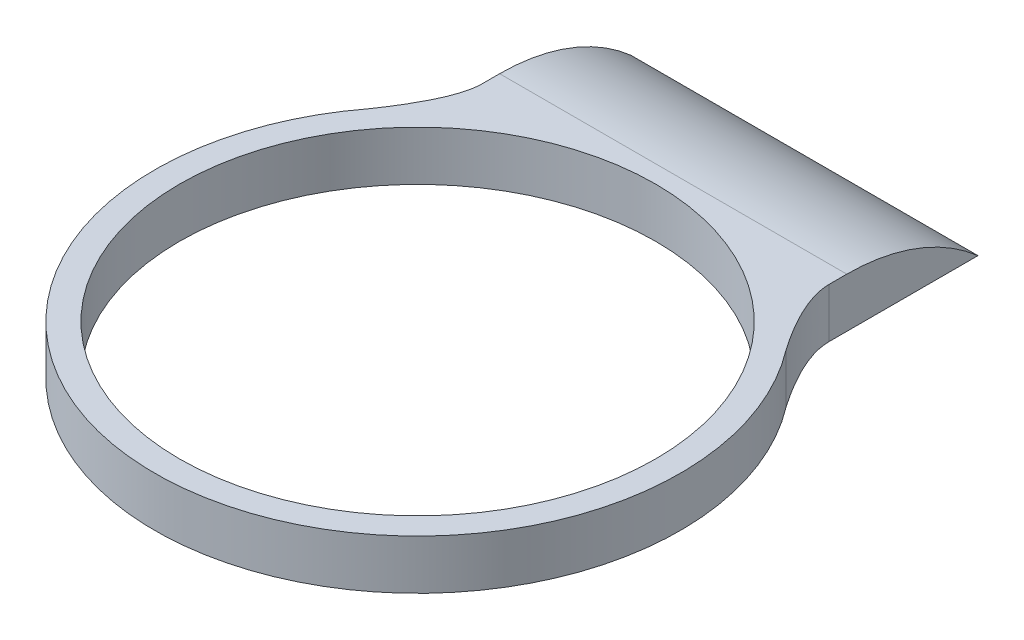
ISO-10303-21;
HEADER;
FILE_DESCRIPTION(('STEP AP214'),'2;1');
FILE_NAME('part.step','',(''),(''),'','','');
FILE_SCHEMA(('AUTOMOTIVE_DESIGN { 1 0 10303 214 1 1 1 1 }'));
ENDSEC;
DATA;
#1=APPLICATION_CONTEXT('core data for automotive mechanical design processes');
#2=APPLICATION_PROTOCOL_DEFINITION('international standard','automotive_design',2000,#1);
#3=PRODUCT_CONTEXT('',#1,'mechanical');
#4=PRODUCT('Part','Part','',(#3));
#5=PRODUCT_RELATED_PRODUCT_CATEGORY('part','',(#4));
#6=PRODUCT_DEFINITION_FORMATION('','',#4);
#7=PRODUCT_DEFINITION_CONTEXT('part definition',#1,'design');
#8=PRODUCT_DEFINITION('design','',#6,#7);
#9=PRODUCT_DEFINITION_SHAPE('','',#8);
#10=(LENGTH_UNIT() NAMED_UNIT(*) SI_UNIT(.MILLI.,.METRE.));
#11=(NAMED_UNIT(*) PLANE_ANGLE_UNIT() SI_UNIT($,.RADIAN.));
#12=(NAMED_UNIT(*) SI_UNIT($,.STERADIAN.) SOLID_ANGLE_UNIT());
#13=UNCERTAINTY_MEASURE_WITH_UNIT(LENGTH_MEASURE(1.E-05),#10,'distance_accuracy_value','');
#14=(GEOMETRIC_REPRESENTATION_CONTEXT(3) GLOBAL_UNCERTAINTY_ASSIGNED_CONTEXT((#13)) GLOBAL_UNIT_ASSIGNED_CONTEXT((#10,
#11,#12)) REPRESENTATION_CONTEXT('',''));
#15=CARTESIAN_POINT('',(0.,0.,0.));
#16=DIRECTION('',(0.,0.,1.));
#17=DIRECTION('',(1.,0.,0.));
#18=AXIS2_PLACEMENT_3D('',#15,#16,#17);
#19=CARTESIAN_POINT('',(35.,10.,-48.));
#20=CARTESIAN_POINT('',(34.9935751898334,10.,-42.5162886207268));
#21=CARTESIAN_POINT('',(42.0937159261247,10.,-32.2043332415177));
#22=B_SPLINE_CURVE_WITH_KNOTS('',2,(#19,#20,#21),.UNSPECIFIED.,.F.,.F.,(3,3),(0.,1.),.UNSPECIFIED.);
#23=DIRECTION('',(0.,-1.,0.));
#24=VECTOR('',#23,1.);
#25=SURFACE_OF_LINEAR_EXTRUSION('',#22,#24);
#26=CARTESIAN_POINT('',(35.,0.,-48.));
#27=CARTESIAN_POINT('',(34.9935751898334,0.,-42.5162886207268));
#28=CARTESIAN_POINT('',(42.0937159261247,0.,-32.2043332415177));
#29=B_SPLINE_CURVE_WITH_KNOTS('',2,(#26,#27,#28),.UNSPECIFIED.,.F.,.F.,(3,3),(0.,1.),.UNSPECIFIED.);
#30=CARTESIAN_POINT('',(35.,0.,-48.));
#31=VERTEX_POINT('',#30);
#32=CARTESIAN_POINT('',(42.0937159261247,0.,-32.2043332415177));
#33=VERTEX_POINT('',#32);
#34=EDGE_CURVE('E106',#31,#33,#29,.T.);
#35=ORIENTED_EDGE('',*,*,#34,.F.);
#36=DIRECTION('',(0.,-1.,0.));
#37=VECTOR('',#36,1.);
#38=CARTESIAN_POINT('',(35.,10.,-48.));
#39=LINE('',#38,#37);
#40=CARTESIAN_POINT('',(35.,10.,-48.));
#41=VERTEX_POINT('',#40);
#42=EDGE_CURVE('E96',#41,#31,#39,.T.);
#43=ORIENTED_EDGE('',*,*,#42,.F.);
#44=CARTESIAN_POINT('',(42.0937159261247,10.,-32.2043332415177));
#45=VERTEX_POINT('',#44);
#46=EDGE_CURVE('E101',#41,#45,#22,.T.);
#47=ORIENTED_EDGE('',*,*,#46,.T.);
#48=DIRECTION('',(0.,-1.,0.));
#49=VECTOR('',#48,1.);
#50=CARTESIAN_POINT('',(42.0937159261247,10.,-32.2043332415177));
#51=LINE('',#50,#49);
#52=EDGE_CURVE('E160',#45,#33,#51,.T.);
#53=ORIENTED_EDGE('',*,*,#52,.T.);
#54=EDGE_LOOP('',(#35,#43,#47,#53));
#55=FACE_BOUND('',#54,.T.);
#56=ADVANCED_FACE('F44',(#55),#25,.T.);
#57=CARTESIAN_POINT('',(35.,10.,0.));
#58=DIRECTION('',(1.,0.,0.));
#59=DIRECTION('',(0.,0.,-1.));
#60=AXIS2_PLACEMENT_3D('',#57,#58,#59);
#61=PLANE('',#60);
#62=DIRECTION('',(0.,0.,1.));
#63=VECTOR('',#62,1.);
#64=CARTESIAN_POINT('',(35.,0.,0.));
#65=LINE('',#64,#63);
#66=CARTESIAN_POINT('',(35.,0.,-78.));
#67=VERTEX_POINT('',#66);
#68=EDGE_CURVE('E165',#67,#31,#65,.T.);
#69=ORIENTED_EDGE('',*,*,#68,.F.);
#70=CARTESIAN_POINT('',(35.,-30.,-51.5424868893541));
#71=DIRECTION('',(1.,0.,0.));
#72=DIRECTION('',(0.,0.,-1.));
#73=AXIS2_PLACEMENT_3D('',#70,#71,#72);
#74=CIRCLE('',#73,40.);
#75=CARTESIAN_POINT('',(35.,10.,-51.5424868893541));
#76=VERTEX_POINT('',#75);
#77=EDGE_CURVE('E67',#67,#76,#74,.T.);
#78=ORIENTED_EDGE('',*,*,#77,.T.);
#79=DIRECTION('',(0.,0.,1.));
#80=VECTOR('',#79,1.);
#81=CARTESIAN_POINT('',(35.,10.,0.));
#82=LINE('',#81,#80);
#83=EDGE_CURVE('E93',#76,#41,#82,.T.);
#84=ORIENTED_EDGE('',*,*,#83,.T.);
#85=ORIENTED_EDGE('',*,*,#42,.T.);
#86=EDGE_LOOP('',(#69,#78,#84,#85));
#87=FACE_BOUND('',#86,.T.);
#88=ADVANCED_FACE('F95',(#87),#61,.T.);
#89=CARTESIAN_POINT('',(-35.,10.,0.));
#90=DIRECTION('',(1.,0.,0.));
#91=DIRECTION('',(0.,0.,-1.));
#92=AXIS2_PLACEMENT_3D('',#89,#90,#91);
#93=PLANE('',#92);
#94=DIRECTION('',(0.,0.,1.));
#95=VECTOR('',#94,1.);
#96=CARTESIAN_POINT('',(-35.,10.,0.));
#97=LINE('',#96,#95);
#98=CARTESIAN_POINT('',(-35.,10.,-51.5424868893541));
#99=VERTEX_POINT('',#98);
#100=CARTESIAN_POINT('',(-35.,10.,-48.));
#101=VERTEX_POINT('',#100);
#102=EDGE_CURVE('E100',#99,#101,#97,.T.);
#103=ORIENTED_EDGE('',*,*,#102,.F.);
#104=CARTESIAN_POINT('',(-35.,-30.,-51.5424868893541));
#105=DIRECTION('',(1.,0.,0.));
#106=DIRECTION('',(0.,0.,-1.));
#107=AXIS2_PLACEMENT_3D('',#104,#105,#106);
#108=CIRCLE('',#107,40.);
#109=CARTESIAN_POINT('',(-35.,0.,-78.));
#110=VERTEX_POINT('',#109);
#111=EDGE_CURVE('E11',#99,#110,#108,.F.);
#112=ORIENTED_EDGE('',*,*,#111,.T.);
#113=DIRECTION('',(0.,0.,1.));
#114=VECTOR('',#113,1.);
#115=CARTESIAN_POINT('',(-35.,0.,0.));
#116=LINE('',#115,#114);
#117=CARTESIAN_POINT('',(-35.,0.,-48.));
#118=VERTEX_POINT('',#117);
#119=EDGE_CURVE('E175',#110,#118,#116,.T.);
#120=ORIENTED_EDGE('',*,*,#119,.T.);
#121=DIRECTION('',(0.,-1.,0.));
#122=VECTOR('',#121,1.);
#123=CARTESIAN_POINT('',(-35.,10.,-48.));
#124=LINE('',#123,#122);
#125=EDGE_CURVE('E109',#101,#118,#124,.T.);
#126=ORIENTED_EDGE('',*,*,#125,.F.);
#127=EDGE_LOOP('',(#103,#112,#120,#126));
#128=FACE_BOUND('',#127,.T.);
#129=ADVANCED_FACE('F134',(#128),#93,.F.);
#130=CARTESIAN_POINT('',(-35.,10.,-48.));
#131=CARTESIAN_POINT('',(-34.9935751898335,10.,-42.5162886207268));
#132=CARTESIAN_POINT('',(-42.0937159261247,10.,-32.2043332415176));
#133=B_SPLINE_CURVE_WITH_KNOTS('',2,(#130,#131,#132),.UNSPECIFIED.,.F.,.F.,(3,3),(0.,1.),.UNSPECIFIED.);
#134=DIRECTION('',(0.,-1.,0.));
#135=VECTOR('',#134,1.);
#136=SURFACE_OF_LINEAR_EXTRUSION('',#133,#135);
#137=CARTESIAN_POINT('',(-35.,0.,-48.));
#138=CARTESIAN_POINT('',(-34.9935751898335,0.,-42.5162886207268));
#139=CARTESIAN_POINT('',(-42.0937159261247,0.,-32.2043332415176));
#140=B_SPLINE_CURVE_WITH_KNOTS('',2,(#137,#138,#139),.UNSPECIFIED.,.F.,.F.,(3,3),(0.,1.),.UNSPECIFIED.);
#141=CARTESIAN_POINT('',(-42.0937159261247,0.,-32.2043332415177));
#142=VERTEX_POINT('',#141);
#143=EDGE_CURVE('E178',#118,#142,#140,.T.);
#144=ORIENTED_EDGE('',*,*,#143,.T.);
#145=DIRECTION('',(0.,-1.,0.));
#146=VECTOR('',#145,1.);
#147=CARTESIAN_POINT('',(-42.0937159261247,10.,-32.2043332415177));
#148=LINE('',#147,#146);
#149=CARTESIAN_POINT('',(-42.0937159261247,10.,-32.2043332415177));
#150=VERTEX_POINT('',#149);
#151=EDGE_CURVE('E191',#150,#142,#148,.T.);
#152=ORIENTED_EDGE('',*,*,#151,.F.);
#153=EDGE_CURVE('E145',#101,#150,#133,.T.);
#154=ORIENTED_EDGE('',*,*,#153,.F.);
#155=ORIENTED_EDGE('',*,*,#125,.T.);
#156=EDGE_LOOP('',(#144,#152,#154,#155));
#157=FACE_BOUND('',#156,.T.);
#158=ADVANCED_FACE('F137',(#157),#136,.F.);
#159=CARTESIAN_POINT('',(0.,10.,0.));
#160=DIRECTION('',(0.,-1.,0.));
#161=DIRECTION('',(0.,0.,-1.));
#162=AXIS2_PLACEMENT_3D('',#159,#160,#161);
#163=CYLINDRICAL_SURFACE('',#162,53.);
#164=CARTESIAN_POINT('',(0.,0.,0.));
#165=DIRECTION('',(0.,1.,0.));
#166=DIRECTION('',(0.,0.,1.));
#167=AXIS2_PLACEMENT_3D('',#164,#165,#166);
#168=CIRCLE('',#167,53.);
#169=EDGE_CURVE('E121',#142,#33,#168,.T.);
#170=ORIENTED_EDGE('',*,*,#169,.T.);
#171=ORIENTED_EDGE('',*,*,#52,.F.);
#172=CARTESIAN_POINT('',(0.,10.,0.));
#173=DIRECTION('',(0.,1.,0.));
#174=DIRECTION('',(0.,0.,1.));
#175=AXIS2_PLACEMENT_3D('',#172,#173,#174);
#176=CIRCLE('',#175,53.);
#177=EDGE_CURVE('E114',#150,#45,#176,.T.);
#178=ORIENTED_EDGE('',*,*,#177,.F.);
#179=ORIENTED_EDGE('',*,*,#151,.T.);
#180=EDGE_LOOP('',(#170,#171,#178,#179));
#181=FACE_BOUND('',#180,.T.);
#182=ADVANCED_FACE('F142',(#181),#163,.T.);
#183=CARTESIAN_POINT('',(0.,10.,0.));
#184=DIRECTION('',(0.,-1.,0.));
#185=DIRECTION('',(0.,0.,-1.));
#186=AXIS2_PLACEMENT_3D('',#183,#184,#185);
#187=CYLINDRICAL_SURFACE('',#186,48.);
#188=CARTESIAN_POINT('',(0.,10.,0.));
#189=DIRECTION('',(0.,1.,0.));
#190=DIRECTION('',(0.,0.,1.));
#191=AXIS2_PLACEMENT_3D('',#188,#189,#190);
#192=CIRCLE('',#191,48.);
#193=CARTESIAN_POINT('',(0.,10.,48.));
#194=VERTEX_POINT('',#193);
#195=EDGE_CURVE('E156',#194,#194,#192,.T.);
#196=ORIENTED_EDGE('',*,*,#195,.T.);
#197=EDGE_LOOP('',(#196));
#198=FACE_BOUND('',#197,.T.);
#199=CARTESIAN_POINT('',(0.,0.,0.));
#200=DIRECTION('',(0.,1.,0.));
#201=DIRECTION('',(0.,0.,1.));
#202=AXIS2_PLACEMENT_3D('',#199,#200,#201);
#203=CIRCLE('',#202,48.);
#204=CARTESIAN_POINT('',(0.,0.,48.));
#205=VERTEX_POINT('',#204);
#206=EDGE_CURVE('E117',#205,#205,#203,.T.);
#207=ORIENTED_EDGE('',*,*,#206,.F.);
#208=EDGE_LOOP('',(#207));
#209=FACE_BOUND('',#208,.T.);
#210=ADVANCED_FACE('F222',(#198,#209),#187,.F.);
#211=CARTESIAN_POINT('',(0.,10.,0.));
#212=DIRECTION('',(0.,1.,0.));
#213=DIRECTION('',(0.,0.,1.));
#214=AXIS2_PLACEMENT_3D('',#211,#212,#213);
#215=PLANE('',#214);
#216=ORIENTED_EDGE('',*,*,#83,.F.);
#217=DIRECTION('',(-1.,0.,0.));
#218=VECTOR('',#217,1.);
#219=CARTESIAN_POINT('',(-35.,10.,-51.5424868893541));
#220=LINE('',#219,#218);
#221=EDGE_CURVE('E53',#76,#99,#220,.T.);
#222=ORIENTED_EDGE('',*,*,#221,.T.);
#223=ORIENTED_EDGE('',*,*,#102,.T.);
#224=ORIENTED_EDGE('',*,*,#153,.T.);
#225=ORIENTED_EDGE('',*,*,#177,.T.);
#226=ORIENTED_EDGE('',*,*,#46,.F.);
#227=EDGE_LOOP('',(#216,#222,#223,#224,#225,#226));
#228=FACE_BOUND('',#227,.T.);
#229=ORIENTED_EDGE('',*,*,#195,.F.);
#230=EDGE_LOOP('',(#229));
#231=FACE_BOUND('',#230,.T.);
#232=ADVANCED_FACE('F111',(#228,#231),#215,.T.);
#233=CARTESIAN_POINT('',(0.,0.,0.));
#234=DIRECTION('',(0.,1.,0.));
#235=DIRECTION('',(0.,0.,1.));
#236=AXIS2_PLACEMENT_3D('',#233,#234,#235);
#237=PLANE('',#236);
#238=ORIENTED_EDGE('',*,*,#34,.T.);
#239=ORIENTED_EDGE('',*,*,#169,.F.);
#240=ORIENTED_EDGE('',*,*,#143,.F.);
#241=ORIENTED_EDGE('',*,*,#119,.F.);
#242=DIRECTION('',(1.,0.,0.));
#243=VECTOR('',#242,1.);
#244=CARTESIAN_POINT('',(0.,0.,-78.));
#245=LINE('',#244,#243);
#246=EDGE_CURVE('E171',#110,#67,#245,.T.);
#247=ORIENTED_EDGE('',*,*,#246,.T.);
#248=ORIENTED_EDGE('',*,*,#68,.T.);
#249=EDGE_LOOP('',(#238,#239,#240,#241,#247,#248));
#250=FACE_BOUND('',#249,.T.);
#251=ORIENTED_EDGE('',*,*,#206,.T.);
#252=EDGE_LOOP('',(#251));
#253=FACE_BOUND('',#252,.T.);
#254=ADVANCED_FACE('F210',(#250,#253),#237,.F.);
#255=CARTESIAN_POINT('',(0.,-30.,-51.5424868893541));
#256=DIRECTION('',(1.,0.,0.));
#257=DIRECTION('',(0.,0.,-1.));
#258=AXIS2_PLACEMENT_3D('',#255,#256,#257);
#259=CYLINDRICAL_SURFACE('',#258,40.);
#260=ORIENTED_EDGE('',*,*,#111,.F.);
#261=ORIENTED_EDGE('',*,*,#221,.F.);
#262=ORIENTED_EDGE('',*,*,#77,.F.);
#263=ORIENTED_EDGE('',*,*,#246,.F.);
#264=EDGE_LOOP('',(#260,#261,#262,#263));
#265=FACE_BOUND('',#264,.T.);
#266=ADVANCED_FACE('F46',(#265),#259,.T.);
#267=CLOSED_SHELL('',(#56,#88,#129,#158,#182,#210,#232,#254,#266));
#268=MANIFOLD_SOLID_BREP('B2',#267);
#269=ADVANCED_BREP_SHAPE_REPRESENTATION('',(#18,#268),#14);
#270=SHAPE_DEFINITION_REPRESENTATION(#9,#269);
ENDSEC;
END-ISO-10303-21;
